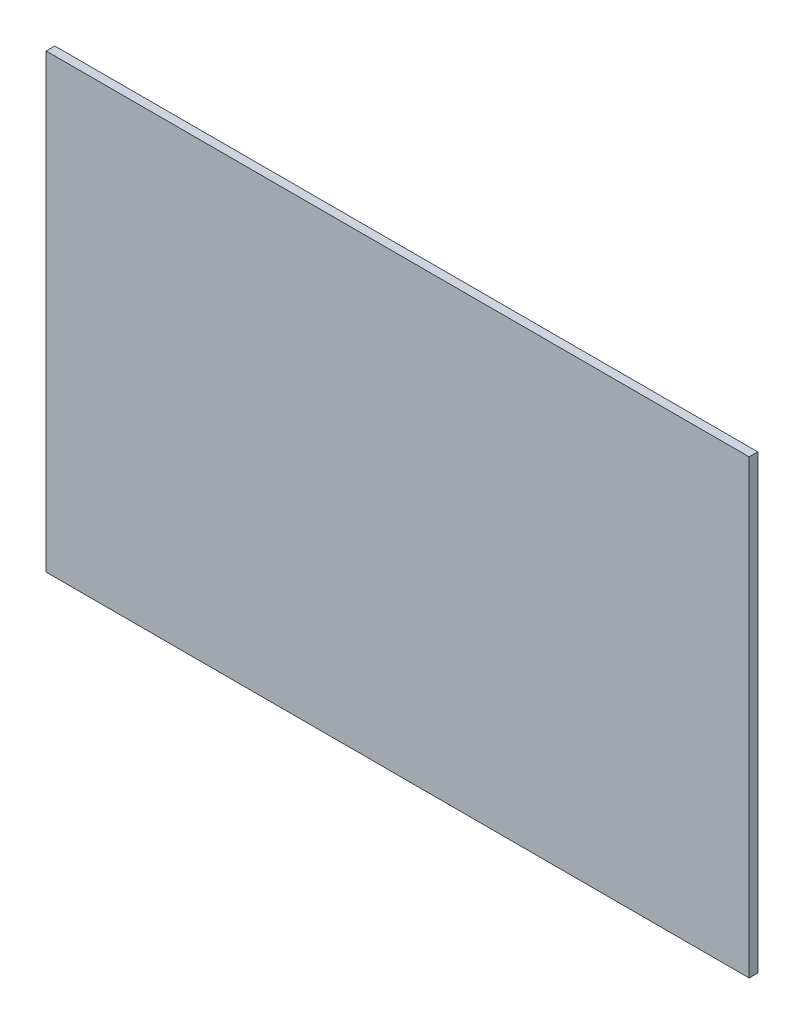
ISO-10303-21;
HEADER;
FILE_DESCRIPTION(('STEP AP214'),'2;1');
FILE_NAME('part.step','',(''),(''),'','','');
FILE_SCHEMA(('AUTOMOTIVE_DESIGN { 1 0 10303 214 1 1 1 1 }'));
ENDSEC;
DATA;
#1=APPLICATION_CONTEXT('core data for automotive mechanical design processes');
#2=APPLICATION_PROTOCOL_DEFINITION('international standard','automotive_design',2000,#1);
#3=PRODUCT_CONTEXT('',#1,'mechanical');
#4=PRODUCT('Part','Part','',(#3));
#5=PRODUCT_RELATED_PRODUCT_CATEGORY('part','',(#4));
#6=PRODUCT_DEFINITION_FORMATION('','',#4);
#7=PRODUCT_DEFINITION_CONTEXT('part definition',#1,'design');
#8=PRODUCT_DEFINITION('design','',#6,#7);
#9=PRODUCT_DEFINITION_SHAPE('','',#8);
#10=(LENGTH_UNIT() NAMED_UNIT(*) SI_UNIT(.MILLI.,.METRE.));
#11=(NAMED_UNIT(*) PLANE_ANGLE_UNIT() SI_UNIT($,.RADIAN.));
#12=(NAMED_UNIT(*) SI_UNIT($,.STERADIAN.) SOLID_ANGLE_UNIT());
#13=UNCERTAINTY_MEASURE_WITH_UNIT(LENGTH_MEASURE(1.E-05),#10,'distance_accuracy_value','');
#14=(GEOMETRIC_REPRESENTATION_CONTEXT(3) GLOBAL_UNCERTAINTY_ASSIGNED_CONTEXT((#13)) GLOBAL_UNIT_ASSIGNED_CONTEXT((#10,
#11,#12)) REPRESENTATION_CONTEXT('',''));
#15=CARTESIAN_POINT('',(0.,0.,0.));
#16=DIRECTION('',(0.,0.,1.));
#17=DIRECTION('',(1.,0.,0.));
#18=AXIS2_PLACEMENT_3D('',#15,#16,#17);
#19=CARTESIAN_POINT('',(0.,0.,92.7987434182518));
#20=DIRECTION('',(0.,0.,1.));
#21=DIRECTION('',(1.,0.,0.));
#22=AXIS2_PLACEMENT_3D('',#19,#20,#21);
#23=PLANE('',#22);
#24=DIRECTION('',(0.,-1.,0.));
#25=VECTOR('',#24,1.);
#26=CARTESIAN_POINT('',(121.107676107944,-54.7662096738514,92.7987434182518));
#27=LINE('',#26,#25);
#28=CARTESIAN_POINT('',(121.107676107944,44.3337903261486,92.7987434182518));
#29=VERTEX_POINT('',#28);
#30=CARTESIAN_POINT('',(121.107676107944,-54.7662096738514,92.7987434182518));
#31=VERTEX_POINT('',#30);
#32=EDGE_CURVE('E80',#29,#31,#27,.T.);
#33=ORIENTED_EDGE('',*,*,#32,.T.);
#34=DIRECTION('',(-1.,0.,0.));
#35=VECTOR('',#34,1.);
#36=CARTESIAN_POINT('',(-33.2523238920562,-54.7662096738513,92.7987434182518));
#37=LINE('',#36,#35);
#38=CARTESIAN_POINT('',(-33.2523238920562,-54.7662096738513,92.7987434182518));
#39=VERTEX_POINT('',#38);
#40=EDGE_CURVE('E67',#31,#39,#37,.T.);
#41=ORIENTED_EDGE('',*,*,#40,.T.);
#42=DIRECTION('',(0.,1.,0.));
#43=VECTOR('',#42,1.);
#44=CARTESIAN_POINT('',(-33.2523238920562,44.3337903261486,92.7987434182518));
#45=LINE('',#44,#43);
#46=CARTESIAN_POINT('',(-33.2523238920562,44.3337903261486,92.7987434182518));
#47=VERTEX_POINT('',#46);
#48=EDGE_CURVE('E54',#39,#47,#45,.T.);
#49=ORIENTED_EDGE('',*,*,#48,.T.);
#50=DIRECTION('',(1.,0.,0.));
#51=VECTOR('',#50,1.);
#52=CARTESIAN_POINT('',(121.107676107944,44.3337903261486,92.7987434182518));
#53=LINE('',#52,#51);
#54=EDGE_CURVE('E19',#47,#29,#53,.T.);
#55=ORIENTED_EDGE('',*,*,#54,.T.);
#56=EDGE_LOOP('',(#33,#41,#49,#55));
#57=FACE_BOUND('',#56,.T.);
#58=ADVANCED_FACE('F16',(#57),#23,.F.);
#59=CARTESIAN_POINT('',(121.107676107944,44.3337903261486,94.6987434182518));
#60=DIRECTION('',(0.,-1.,0.));
#61=DIRECTION('',(1.,0.,0.));
#62=AXIS2_PLACEMENT_3D('',#59,#60,#61);
#63=PLANE('',#62);
#64=DIRECTION('',(0.,0.,1.));
#65=VECTOR('',#64,1.);
#66=CARTESIAN_POINT('',(-33.2523238920562,44.3337903261486,94.6987434182518));
#67=LINE('',#66,#65);
#68=CARTESIAN_POINT('',(-33.2523238920562,44.3337903261486,94.6987434182518));
#69=VERTEX_POINT('',#68);
#70=EDGE_CURVE('E60',#47,#69,#67,.T.);
#71=ORIENTED_EDGE('',*,*,#70,.T.);
#72=DIRECTION('',(1.,0.,0.));
#73=VECTOR('',#72,1.);
#74=CARTESIAN_POINT('',(0.,44.3337903261486,94.6987434182518));
#75=LINE('',#74,#73);
#76=CARTESIAN_POINT('',(121.107676107944,44.3337903261486,94.6987434182518));
#77=VERTEX_POINT('',#76);
#78=EDGE_CURVE('E82',#77,#69,#75,.F.);
#79=ORIENTED_EDGE('',*,*,#78,.F.);
#80=DIRECTION('',(0.,0.,1.));
#81=VECTOR('',#80,1.);
#82=CARTESIAN_POINT('',(121.107676107944,44.3337903261486,94.6987434182518));
#83=LINE('',#82,#81);
#84=EDGE_CURVE('E63',#77,#29,#83,.F.);
#85=ORIENTED_EDGE('',*,*,#84,.T.);
#86=ORIENTED_EDGE('',*,*,#54,.F.);
#87=EDGE_LOOP('',(#71,#79,#85,#86));
#88=FACE_BOUND('',#87,.T.);
#89=ADVANCED_FACE('F59',(#88),#63,.F.);
#90=CARTESIAN_POINT('',(-33.2523238920562,44.3337903261486,94.6987434182518));
#91=DIRECTION('',(1.,0.,0.));
#92=DIRECTION('',(0.,1.,0.));
#93=AXIS2_PLACEMENT_3D('',#90,#91,#92);
#94=PLANE('',#93);
#95=DIRECTION('',(0.,0.,1.));
#96=VECTOR('',#95,1.);
#97=CARTESIAN_POINT('',(-33.2523238920562,-54.7662096738513,94.6987434182518));
#98=LINE('',#97,#96);
#99=CARTESIAN_POINT('',(-33.2523238920562,-54.7662096738513,94.6987434182518));
#100=VERTEX_POINT('',#99);
#101=EDGE_CURVE('E69',#39,#100,#98,.T.);
#102=ORIENTED_EDGE('',*,*,#101,.T.);
#103=DIRECTION('',(0.,1.,0.));
#104=VECTOR('',#103,1.);
#105=CARTESIAN_POINT('',(-33.2523238920562,0.,94.6987434182518));
#106=LINE('',#105,#104);
#107=EDGE_CURVE('E73',#69,#100,#106,.F.);
#108=ORIENTED_EDGE('',*,*,#107,.F.);
#109=ORIENTED_EDGE('',*,*,#70,.F.);
#110=ORIENTED_EDGE('',*,*,#48,.F.);
#111=EDGE_LOOP('',(#102,#108,#109,#110));
#112=FACE_BOUND('',#111,.T.);
#113=ADVANCED_FACE('F71',(#112),#94,.F.);
#114=CARTESIAN_POINT('',(-33.2523238920562,-54.7662096738513,94.6987434182518));
#115=DIRECTION('',(0.,1.,0.));
#116=DIRECTION('',(-1.,0.,0.));
#117=AXIS2_PLACEMENT_3D('',#114,#115,#116);
#118=PLANE('',#117);
#119=DIRECTION('',(0.,0.,1.));
#120=VECTOR('',#119,1.);
#121=CARTESIAN_POINT('',(121.107676107944,-54.7662096738514,94.6987434182518));
#122=LINE('',#121,#120);
#123=CARTESIAN_POINT('',(121.107676107944,-54.7662096738514,94.6987434182518));
#124=VERTEX_POINT('',#123);
#125=EDGE_CURVE('E34',#31,#124,#122,.T.);
#126=ORIENTED_EDGE('',*,*,#125,.T.);
#127=DIRECTION('',(1.,0.,0.));
#128=VECTOR('',#127,1.);
#129=CARTESIAN_POINT('',(0.,-54.7662096738513,94.6987434182518));
#130=LINE('',#129,#128);
#131=EDGE_CURVE('E25',#100,#124,#130,.T.);
#132=ORIENTED_EDGE('',*,*,#131,.F.);
#133=ORIENTED_EDGE('',*,*,#101,.F.);
#134=ORIENTED_EDGE('',*,*,#40,.F.);
#135=EDGE_LOOP('',(#126,#132,#133,#134));
#136=FACE_BOUND('',#135,.T.);
#137=ADVANCED_FACE('F88',(#136),#118,.F.);
#138=CARTESIAN_POINT('',(121.107676107944,-54.7662096738514,94.6987434182518));
#139=DIRECTION('',(-1.,0.,0.));
#140=DIRECTION('',(0.,-1.,0.));
#141=AXIS2_PLACEMENT_3D('',#138,#139,#140);
#142=PLANE('',#141);
#143=ORIENTED_EDGE('',*,*,#84,.F.);
#144=DIRECTION('',(0.,1.,0.));
#145=VECTOR('',#144,1.);
#146=CARTESIAN_POINT('',(121.107676107944,0.,94.6987434182518));
#147=LINE('',#146,#145);
#148=EDGE_CURVE('E11',#124,#77,#147,.T.);
#149=ORIENTED_EDGE('',*,*,#148,.F.);
#150=ORIENTED_EDGE('',*,*,#125,.F.);
#151=ORIENTED_EDGE('',*,*,#32,.F.);
#152=EDGE_LOOP('',(#143,#149,#150,#151));
#153=FACE_BOUND('',#152,.T.);
#154=ADVANCED_FACE('F90',(#153),#142,.F.);
#155=CARTESIAN_POINT('',(0.,0.,94.6987434182518));
#156=DIRECTION('',(0.,0.,1.));
#157=DIRECTION('',(1.,0.,0.));
#158=AXIS2_PLACEMENT_3D('',#155,#156,#157);
#159=PLANE('',#158);
#160=ORIENTED_EDGE('',*,*,#131,.T.);
#161=ORIENTED_EDGE('',*,*,#148,.T.);
#162=ORIENTED_EDGE('',*,*,#78,.T.);
#163=ORIENTED_EDGE('',*,*,#107,.T.);
#164=EDGE_LOOP('',(#160,#161,#162,#163));
#165=FACE_BOUND('',#164,.T.);
#166=ADVANCED_FACE('F87',(#165),#159,.T.);
#167=CLOSED_SHELL('',(#58,#89,#113,#137,#154,#166));
#168=MANIFOLD_SOLID_BREP('B1',#167);
#169=ADVANCED_BREP_SHAPE_REPRESENTATION('',(#18,#168),#14);
#170=SHAPE_DEFINITION_REPRESENTATION(#9,#169);
ENDSEC;
END-ISO-10303-21;
